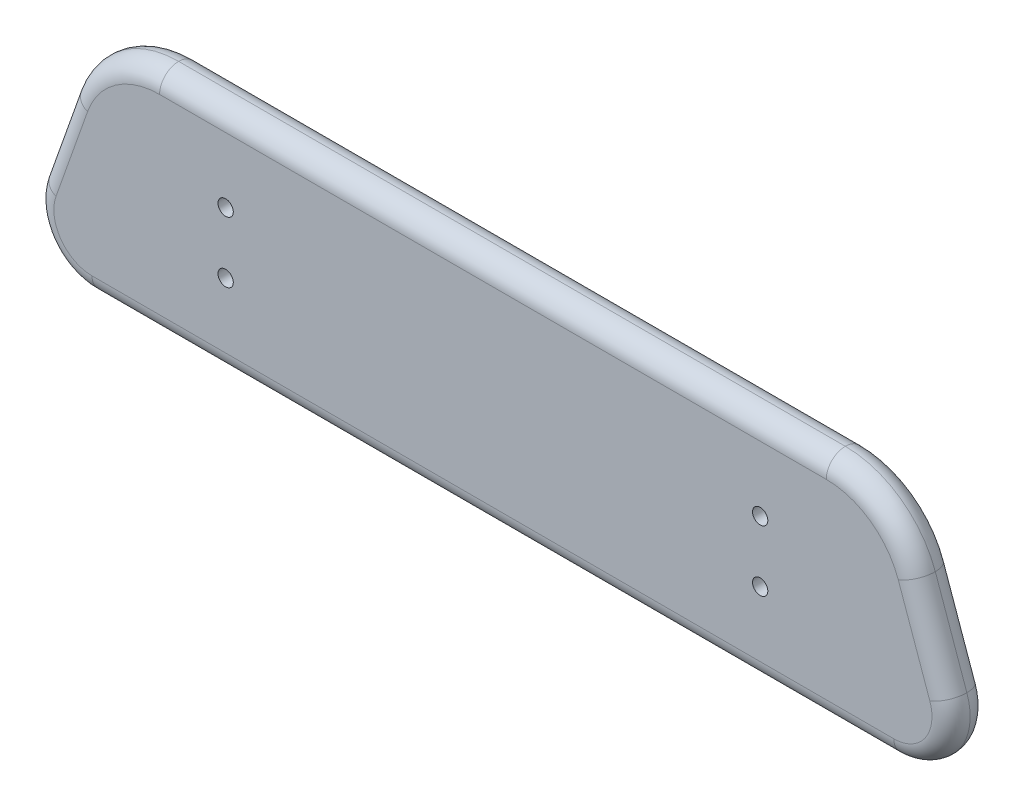
ISO-10303-21;
HEADER;
FILE_DESCRIPTION(('STEP AP214'),'2;1');
FILE_NAME('part.step','',(''),(''),'','','');
FILE_SCHEMA(('AUTOMOTIVE_DESIGN { 1 0 10303 214 1 1 1 1 }'));
ENDSEC;
DATA;
#1=APPLICATION_CONTEXT('core data for automotive mechanical design processes');
#2=APPLICATION_PROTOCOL_DEFINITION('international standard','automotive_design',2000,#1);
#3=PRODUCT_CONTEXT('',#1,'mechanical');
#4=PRODUCT('Part','Part','',(#3));
#5=PRODUCT_RELATED_PRODUCT_CATEGORY('part','',(#4));
#6=PRODUCT_DEFINITION_FORMATION('','',#4);
#7=PRODUCT_DEFINITION_CONTEXT('part definition',#1,'design');
#8=PRODUCT_DEFINITION('design','',#6,#7);
#9=PRODUCT_DEFINITION_SHAPE('','',#8);
#10=(LENGTH_UNIT() NAMED_UNIT(*) SI_UNIT(.MILLI.,.METRE.));
#11=(NAMED_UNIT(*) PLANE_ANGLE_UNIT() SI_UNIT($,.RADIAN.));
#12=(NAMED_UNIT(*) SI_UNIT($,.STERADIAN.) SOLID_ANGLE_UNIT());
#13=UNCERTAINTY_MEASURE_WITH_UNIT(LENGTH_MEASURE(1.E-05),#10,'distance_accuracy_value','');
#14=(GEOMETRIC_REPRESENTATION_CONTEXT(3) GLOBAL_UNCERTAINTY_ASSIGNED_CONTEXT((#13)) GLOBAL_UNIT_ASSIGNED_CONTEXT((#10,
#11,#12)) REPRESENTATION_CONTEXT('',''));
#15=CARTESIAN_POINT('',(0.,0.,0.));
#16=DIRECTION('',(0.,0.,1.));
#17=DIRECTION('',(1.,0.,0.));
#18=AXIS2_PLACEMENT_3D('',#15,#16,#17);
#19=CARTESIAN_POINT('',(-105.000000000001,15.,9.99999999999989));
#20=DIRECTION('',(0.,0.,-1.));
#21=DIRECTION('',(-1.00000000000001,0.,0.));
#22=AXIS2_PLACEMENT_3D('',#19,#20,#21);
#23=PLANE('',#22);
#24=DIRECTION('',(-0.333806859233776,-0.942641491092183,0.));
#25=VECTOR('',#24,1.);
#26=CARTESIAN_POINT('',(-114.426414910922,18.3380685923378,9.99999999999989));
#27=LINE('',#26,#25);
#28=CARTESIAN_POINT('',(-106.16197137538,41.6761371846756,9.99999999999989));
#29=VERTEX_POINT('',#28);
#30=CARTESIAN_POINT('',(-114.426414910922,18.3380685923378,9.99999999999989));
#31=VERTEX_POINT('',#30);
#32=EDGE_CURVE('E52',#29,#31,#27,.T.);
#33=ORIENTED_EDGE('',*,*,#32,.T.);
#34=CARTESIAN_POINT('',(-105.000000000001,15.,9.99999999999989));
#35=DIRECTION('',(0.,0.,-1.));
#36=DIRECTION('',(-1.00000000000001,0.,0.));
#37=AXIS2_PLACEMENT_3D('',#34,#35,#36);
#38=CIRCLE('',#37,9.99999999999999);
#39=CARTESIAN_POINT('',(-105.000000000001,5.,10.));
#40=VERTEX_POINT('',#39);
#41=EDGE_CURVE('E11',#31,#40,#38,.F.);
#42=ORIENTED_EDGE('',*,*,#41,.T.);
#43=DIRECTION('',(1.00000000000001,0.,0.));
#44=VECTOR('',#43,1.);
#45=CARTESIAN_POINT('',(-105.000000000001,5.,10.));
#46=LINE('',#45,#44);
#47=CARTESIAN_POINT('',(105.000000000001,4.99999999999987,10.));
#48=VERTEX_POINT('',#47);
#49=EDGE_CURVE('E309',#40,#48,#46,.T.);
#50=ORIENTED_EDGE('',*,*,#49,.T.);
#51=CARTESIAN_POINT('',(105.000000000001,15.,10.));
#52=DIRECTION('',(0.,0.,-1.));
#53=DIRECTION('',(-1.00000000000001,0.,0.));
#54=AXIS2_PLACEMENT_3D('',#51,#52,#53);
#55=CIRCLE('',#54,10.);
#56=CARTESIAN_POINT('',(114.426414910922,18.3380685923378,10.));
#57=VERTEX_POINT('',#56);
#58=EDGE_CURVE('E312',#48,#57,#55,.F.);
#59=ORIENTED_EDGE('',*,*,#58,.T.);
#60=DIRECTION('',(-0.333806859233776,0.942641491092182,0.));
#61=VECTOR('',#60,1.);
#62=CARTESIAN_POINT('',(91.0267408639035,84.4167096525717,10.));
#63=LINE('',#62,#61);
#64=CARTESIAN_POINT('',(106.16197137538,41.6761371846756,10.));
#65=VERTEX_POINT('',#64);
#66=EDGE_CURVE('E315',#57,#65,#63,.T.);
#67=ORIENTED_EDGE('',*,*,#66,.T.);
#68=CARTESIAN_POINT('',(87.3091415535364,35.0000000000001,10.));
#69=DIRECTION('',(0.,0.,-1.));
#70=DIRECTION('',(-1.00000000000001,0.,0.));
#71=AXIS2_PLACEMENT_3D('',#68,#69,#70);
#72=CIRCLE('',#71,20.);
#73=CARTESIAN_POINT('',(87.3091415535363,55.0000000000002,10.));
#74=VERTEX_POINT('',#73);
#75=EDGE_CURVE('E144',#65,#74,#72,.F.);
#76=ORIENTED_EDGE('',*,*,#75,.T.);
#77=DIRECTION('',(-1.00000000000001,0.,0.));
#78=VECTOR('',#77,1.);
#79=CARTESIAN_POINT('',(-105.000000000001,55.0000000000002,9.99999999999995));
#80=LINE('',#79,#78);
#81=CARTESIAN_POINT('',(-87.3091415535363,55.0000000000002,9.99999999999995));
#82=VERTEX_POINT('',#81);
#83=EDGE_CURVE('E138',#74,#82,#80,.T.);
#84=ORIENTED_EDGE('',*,*,#83,.T.);
#85=CARTESIAN_POINT('',(-87.3091415535362,35.0000000000001,9.99999999999989));
#86=DIRECTION('',(0.,0.,-1.));
#87=DIRECTION('',(-1.00000000000001,0.,0.));
#88=AXIS2_PLACEMENT_3D('',#85,#86,#87);
#89=CIRCLE('',#88,20.);
#90=EDGE_CURVE('E142',#82,#29,#89,.F.);
#91=ORIENTED_EDGE('',*,*,#90,.T.);
#92=EDGE_LOOP('',(#33,#42,#50,#59,#67,#76,#84,#91));
#93=FACE_BOUND('',#92,.T.);
#94=CARTESIAN_POINT('',(-70.0000000000002,38.0000000000001,9.99999999999989));
#95=DIRECTION('',(0.,0.,1.));
#96=DIRECTION('',(1.00000000000001,0.,0.));
#97=AXIS2_PLACEMENT_3D('',#94,#95,#96);
#98=CIRCLE('',#97,2.);
#99=CARTESIAN_POINT('',(-68.0000000000002,38.0000000000001,9.99999999999989));
#100=VERTEX_POINT('',#99);
#101=EDGE_CURVE('E267',#100,#100,#98,.T.);
#102=ORIENTED_EDGE('',*,*,#101,.F.);
#103=EDGE_LOOP('',(#102));
#104=FACE_BOUND('',#103,.T.);
#105=CARTESIAN_POINT('',(70.0000000000003,22.,10.));
#106=DIRECTION('',(0.,0.,1.));
#107=DIRECTION('',(-1.00000000000001,0.,0.));
#108=AXIS2_PLACEMENT_3D('',#105,#106,#107);
#109=CIRCLE('',#108,2.);
#110=CARTESIAN_POINT('',(68.0000000000003,22.,10.));
#111=VERTEX_POINT('',#110);
#112=EDGE_CURVE('E259',#111,#111,#109,.T.);
#113=ORIENTED_EDGE('',*,*,#112,.F.);
#114=EDGE_LOOP('',(#113));
#115=FACE_BOUND('',#114,.T.);
#116=CARTESIAN_POINT('',(70.0000000000005,38.0000000000001,10.));
#117=DIRECTION('',(0.,0.,1.));
#118=DIRECTION('',(-1.00000000000001,0.,0.));
#119=AXIS2_PLACEMENT_3D('',#116,#117,#118);
#120=CIRCLE('',#119,2.);
#121=CARTESIAN_POINT('',(68.0000000000005,38.0000000000001,10.));
#122=VERTEX_POINT('',#121);
#123=EDGE_CURVE('E248',#122,#122,#120,.T.);
#124=ORIENTED_EDGE('',*,*,#123,.F.);
#125=EDGE_LOOP('',(#124));
#126=FACE_BOUND('',#125,.T.);
#127=CARTESIAN_POINT('',(-70.0000000000003,22.,9.99999999999989));
#128=DIRECTION('',(0.,0.,1.));
#129=DIRECTION('',(1.00000000000001,0.,0.));
#130=AXIS2_PLACEMENT_3D('',#127,#128,#129);
#131=CIRCLE('',#130,2.);
#132=CARTESIAN_POINT('',(-68.0000000000003,22.,9.99999999999989));
#133=VERTEX_POINT('',#132);
#134=EDGE_CURVE('E266',#133,#133,#131,.T.);
#135=ORIENTED_EDGE('',*,*,#134,.F.);
#136=EDGE_LOOP('',(#135));
#137=FACE_BOUND('',#136,.T.);
#138=ADVANCED_FACE('F41',(#93,#104,#115,#126,#137),#23,.F.);
#139=CARTESIAN_POINT('',(-105.000000000001,14.9999999999999,-1.17961196366423E-13));
#140=DIRECTION('',(0.,0.,-1.));
#141=DIRECTION('',(-1.00000000000001,0.,0.));
#142=AXIS2_PLACEMENT_3D('',#139,#140,#141);
#143=PLANE('',#142);
#144=DIRECTION('',(1.00000000000001,0.,0.));
#145=VECTOR('',#144,1.);
#146=CARTESIAN_POINT('',(-105.000000000001,4.99999999999999,-1.17961196366423E-13));
#147=LINE('',#146,#145);
#148=CARTESIAN_POINT('',(105.000000000001,5.,0.));
#149=VERTEX_POINT('',#148);
#150=CARTESIAN_POINT('',(-105.000000000001,4.99999999999999,-1.17961196366423E-13));
#151=VERTEX_POINT('',#150);
#152=EDGE_CURVE('E282',#149,#151,#147,.F.);
#153=ORIENTED_EDGE('',*,*,#152,.T.);
#154=CARTESIAN_POINT('',(-105.000000000001,14.9999999999999,-1.17961196366423E-13));
#155=DIRECTION('',(0.,0.,-1.));
#156=DIRECTION('',(-1.00000000000001,0.,0.));
#157=AXIS2_PLACEMENT_3D('',#154,#155,#156);
#158=CIRCLE('',#157,9.99999999999999);
#159=CARTESIAN_POINT('',(-114.426414910922,18.3380685923378,-1.17961196366423E-13));
#160=VERTEX_POINT('',#159);
#161=EDGE_CURVE('E305',#151,#160,#158,.T.);
#162=ORIENTED_EDGE('',*,*,#161,.T.);
#163=DIRECTION('',(-0.333806859233776,-0.942641491092183,0.));
#164=VECTOR('',#163,1.);
#165=CARTESIAN_POINT('',(-106.16197137538,41.6761371846757,-1.17961196366423E-13));
#166=LINE('',#165,#164);
#167=CARTESIAN_POINT('',(-106.16197137538,41.6761371846757,-1.17961196366423E-13));
#168=VERTEX_POINT('',#167);
#169=EDGE_CURVE('E302',#160,#168,#166,.F.);
#170=ORIENTED_EDGE('',*,*,#169,.T.);
#171=CARTESIAN_POINT('',(-87.3091415535362,35.0000000000001,-1.17961196366423E-13));
#172=DIRECTION('',(0.,0.,-1.));
#173=DIRECTION('',(-1.00000000000001,0.,0.));
#174=AXIS2_PLACEMENT_3D('',#171,#172,#173);
#175=CIRCLE('',#174,20.);
#176=CARTESIAN_POINT('',(-87.3091415535363,55.0000000000002,0.));
#177=VERTEX_POINT('',#176);
#178=EDGE_CURVE('E299',#168,#177,#175,.T.);
#179=ORIENTED_EDGE('',*,*,#178,.T.);
#180=DIRECTION('',(-1.00000000000001,0.,0.));
#181=VECTOR('',#180,1.);
#182=CARTESIAN_POINT('',(87.3091415535363,55.0000000000002,0.));
#183=LINE('',#182,#181);
#184=CARTESIAN_POINT('',(87.3091415535363,55.0000000000002,0.));
#185=VERTEX_POINT('',#184);
#186=EDGE_CURVE('E296',#177,#185,#183,.F.);
#187=ORIENTED_EDGE('',*,*,#186,.T.);
#188=CARTESIAN_POINT('',(87.3091415535364,35.0000000000001,0.));
#189=DIRECTION('',(0.,0.,-1.));
#190=DIRECTION('',(-1.00000000000001,0.,0.));
#191=AXIS2_PLACEMENT_3D('',#188,#189,#190);
#192=CIRCLE('',#191,20.);
#193=CARTESIAN_POINT('',(106.16197137538,41.6761371846756,0.));
#194=VERTEX_POINT('',#193);
#195=EDGE_CURVE('E293',#185,#194,#192,.T.);
#196=ORIENTED_EDGE('',*,*,#195,.T.);
#197=DIRECTION('',(-0.333806859233776,0.942641491092182,0.));
#198=VECTOR('',#197,1.);
#199=CARTESIAN_POINT('',(114.426414910922,18.3380685923378,0.));
#200=LINE('',#199,#198);
#201=CARTESIAN_POINT('',(114.426414910922,18.3380685923378,0.));
#202=VERTEX_POINT('',#201);
#203=EDGE_CURVE('E290',#194,#202,#200,.F.);
#204=ORIENTED_EDGE('',*,*,#203,.T.);
#205=CARTESIAN_POINT('',(105.000000000001,15.,0.));
#206=DIRECTION('',(0.,0.,-1.));
#207=DIRECTION('',(-1.00000000000001,0.,0.));
#208=AXIS2_PLACEMENT_3D('',#205,#206,#207);
#209=CIRCLE('',#208,10.);
#210=EDGE_CURVE('E102',#202,#149,#209,.T.);
#211=ORIENTED_EDGE('',*,*,#210,.T.);
#212=EDGE_LOOP('',(#153,#162,#170,#179,#187,#196,#204,#211));
#213=FACE_BOUND('',#212,.T.);
#214=ADVANCED_FACE('F384',(#213),#143,.T.);
#215=CARTESIAN_POINT('',(-70.0000000000003,22.,1.99999999999988));
#216=DIRECTION('',(0.,0.,1.));
#217=DIRECTION('',(1.00000000000001,0.,0.));
#218=AXIS2_PLACEMENT_3D('',#215,#216,#217);
#219=CYLINDRICAL_SURFACE('',#218,2.);
#220=CARTESIAN_POINT('',(-70.0000000000003,22.,1.99999999999988));
#221=DIRECTION('',(0.,0.,1.));
#222=DIRECTION('',(1.00000000000001,0.,0.));
#223=AXIS2_PLACEMENT_3D('',#220,#221,#222);
#224=CIRCLE('',#223,2.);
#225=CARTESIAN_POINT('',(-68.0000000000003,22.,1.99999999999988));
#226=VERTEX_POINT('',#225);
#227=EDGE_CURVE('E278',#226,#226,#224,.T.);
#228=ORIENTED_EDGE('',*,*,#227,.F.);
#229=EDGE_LOOP('',(#228));
#230=FACE_BOUND('',#229,.T.);
#231=ORIENTED_EDGE('',*,*,#134,.T.);
#232=EDGE_LOOP('',(#231));
#233=FACE_BOUND('',#232,.T.);
#234=ADVANCED_FACE('F389',(#230,#233),#219,.F.);
#235=CARTESIAN_POINT('',(-70.0000000000003,22.,1.99999999999988));
#236=DIRECTION('',(0.,0.,1.));
#237=DIRECTION('',(1.00000000000001,0.,0.));
#238=AXIS2_PLACEMENT_3D('',#235,#236,#237);
#239=PLANE('',#238);
#240=ORIENTED_EDGE('',*,*,#227,.T.);
#241=EDGE_LOOP('',(#240));
#242=FACE_BOUND('',#241,.T.);
#243=ADVANCED_FACE('F566',(#242),#239,.T.);
#244=CARTESIAN_POINT('',(70.0000000000005,38.0000000000001,2.));
#245=DIRECTION('',(0.,0.,1.));
#246=DIRECTION('',(1.00000000000001,0.,0.));
#247=AXIS2_PLACEMENT_3D('',#244,#245,#246);
#248=CYLINDRICAL_SURFACE('',#247,2.);
#249=CARTESIAN_POINT('',(70.0000000000005,38.0000000000001,2.));
#250=DIRECTION('',(0.,0.,1.));
#251=DIRECTION('',(-1.00000000000001,0.,0.));
#252=AXIS2_PLACEMENT_3D('',#249,#250,#251);
#253=CIRCLE('',#252,2.);
#254=CARTESIAN_POINT('',(68.0000000000005,38.0000000000001,2.));
#255=VERTEX_POINT('',#254);
#256=EDGE_CURVE('E252',#255,#255,#253,.T.);
#257=ORIENTED_EDGE('',*,*,#256,.F.);
#258=EDGE_LOOP('',(#257));
#259=FACE_BOUND('',#258,.T.);
#260=ORIENTED_EDGE('',*,*,#123,.T.);
#261=EDGE_LOOP('',(#260));
#262=FACE_BOUND('',#261,.T.);
#263=ADVANCED_FACE('F557',(#259,#262),#248,.F.);
#264=CARTESIAN_POINT('',(70.0000000000005,38.0000000000001,2.));
#265=DIRECTION('',(0.,0.,-1.));
#266=DIRECTION('',(-1.00000000000001,0.,0.));
#267=AXIS2_PLACEMENT_3D('',#264,#265,#266);
#268=PLANE('',#267);
#269=ORIENTED_EDGE('',*,*,#256,.T.);
#270=EDGE_LOOP('',(#269));
#271=FACE_BOUND('',#270,.T.);
#272=ADVANCED_FACE('F548',(#271),#268,.F.);
#273=CARTESIAN_POINT('',(70.0000000000003,22.,2.));
#274=DIRECTION('',(0.,0.,1.));
#275=DIRECTION('',(1.00000000000001,0.,0.));
#276=AXIS2_PLACEMENT_3D('',#273,#274,#275);
#277=CYLINDRICAL_SURFACE('',#276,2.);
#278=CARTESIAN_POINT('',(70.0000000000003,22.,2.));
#279=DIRECTION('',(0.,0.,1.));
#280=DIRECTION('',(-1.00000000000001,0.,0.));
#281=AXIS2_PLACEMENT_3D('',#278,#279,#280);
#282=CIRCLE('',#281,2.);
#283=CARTESIAN_POINT('',(68.0000000000003,22.,2.));
#284=VERTEX_POINT('',#283);
#285=EDGE_CURVE('E271',#284,#284,#282,.T.);
#286=ORIENTED_EDGE('',*,*,#285,.F.);
#287=EDGE_LOOP('',(#286));
#288=FACE_BOUND('',#287,.T.);
#289=ORIENTED_EDGE('',*,*,#112,.T.);
#290=EDGE_LOOP('',(#289));
#291=FACE_BOUND('',#290,.T.);
#292=ADVANCED_FACE('F539',(#288,#291),#277,.F.);
#293=CARTESIAN_POINT('',(70.0000000000003,22.,2.));
#294=DIRECTION('',(0.,0.,-1.));
#295=DIRECTION('',(-1.00000000000001,0.,0.));
#296=AXIS2_PLACEMENT_3D('',#293,#294,#295);
#297=PLANE('',#296);
#298=ORIENTED_EDGE('',*,*,#285,.T.);
#299=EDGE_LOOP('',(#298));
#300=FACE_BOUND('',#299,.T.);
#301=ADVANCED_FACE('F530',(#300),#297,.F.);
#302=CARTESIAN_POINT('',(-70.0000000000002,38.0000000000001,1.99999999999988));
#303=DIRECTION('',(0.,0.,1.));
#304=DIRECTION('',(1.00000000000001,0.,0.));
#305=AXIS2_PLACEMENT_3D('',#302,#303,#304);
#306=CYLINDRICAL_SURFACE('',#305,2.);
#307=CARTESIAN_POINT('',(-70.0000000000002,38.0000000000001,1.99999999999988));
#308=DIRECTION('',(0.,0.,1.));
#309=DIRECTION('',(1.00000000000001,0.,0.));
#310=AXIS2_PLACEMENT_3D('',#307,#308,#309);
#311=CIRCLE('',#310,2.);
#312=CARTESIAN_POINT('',(-68.0000000000002,38.0000000000001,1.99999999999988));
#313=VERTEX_POINT('',#312);
#314=EDGE_CURVE('E262',#313,#313,#311,.T.);
#315=ORIENTED_EDGE('',*,*,#314,.F.);
#316=EDGE_LOOP('',(#315));
#317=FACE_BOUND('',#316,.T.);
#318=ORIENTED_EDGE('',*,*,#101,.T.);
#319=EDGE_LOOP('',(#318));
#320=FACE_BOUND('',#319,.T.);
#321=ADVANCED_FACE('F521',(#317,#320),#306,.F.);
#322=CARTESIAN_POINT('',(-70.0000000000002,38.0000000000001,1.99999999999988));
#323=DIRECTION('',(0.,0.,1.));
#324=DIRECTION('',(1.00000000000001,0.,0.));
#325=AXIS2_PLACEMENT_3D('',#322,#323,#324);
#326=PLANE('',#325);
#327=ORIENTED_EDGE('',*,*,#314,.T.);
#328=EDGE_LOOP('',(#327));
#329=FACE_BOUND('',#328,.T.);
#330=ADVANCED_FACE('F514',(#329),#326,.T.);
#331=CARTESIAN_POINT('',(87.3091415535364,35.0000000000001,5.));
#332=DIRECTION('',(0.,0.,-1.));
#333=DIRECTION('',(-1.00000000000001,0.,0.));
#334=AXIS2_PLACEMENT_3D('',#331,#332,#333);
#335=TOROIDAL_SURFACE('',#334,20.,5.);
#336=CARTESIAN_POINT('',(87.3091415535363,55.0000000000002,5.));
#337=DIRECTION('',(-1.00000000000001,0.,0.));
#338=DIRECTION('',(0.,0.,1.));
#339=AXIS2_PLACEMENT_3D('',#336,#337,#338);
#340=CIRCLE('',#339,5.);
#341=CARTESIAN_POINT('',(87.3091415535364,60.0000000000003,5.));
#342=VERTEX_POINT('',#341);
#343=EDGE_CURVE('E45',#74,#342,#340,.T.);
#344=ORIENTED_EDGE('',*,*,#343,.F.);
#345=ORIENTED_EDGE('',*,*,#75,.F.);
#346=CARTESIAN_POINT('',(106.16197137538,41.6761371846756,5.));
#347=DIRECTION('',(0.333806859233776,-0.942641491092182,0.));
#348=DIRECTION('',(0.942641491092182,0.333806859233776,0.));
#349=AXIS2_PLACEMENT_3D('',#346,#347,#348);
#350=CIRCLE('',#349,5.);
#351=CARTESIAN_POINT('',(110.875178830841,43.3451714808446,5.));
#352=VERTEX_POINT('',#351);
#353=EDGE_CURVE('E88',#352,#65,#350,.T.);
#354=ORIENTED_EDGE('',*,*,#353,.F.);
#355=CARTESIAN_POINT('',(87.3091415535364,35.0000000000001,5.));
#356=DIRECTION('',(0.,0.,-1.));
#357=DIRECTION('',(-1.00000000000001,0.,0.));
#358=AXIS2_PLACEMENT_3D('',#355,#356,#357);
#359=CIRCLE('',#358,25.);
#360=EDGE_CURVE('E240',#342,#352,#359,.T.);
#361=ORIENTED_EDGE('',*,*,#360,.F.);
#362=EDGE_LOOP('',(#344,#345,#354,#361));
#363=FACE_BOUND('',#362,.T.);
#364=ADVANCED_FACE('F43',(#363),#335,.T.);
#365=CARTESIAN_POINT('',(-105.000000000001,55.0000000000002,5.));
#366=DIRECTION('',(-1.00000000000001,0.,0.));
#367=DIRECTION('',(0.,-1.00000000000001,0.));
#368=AXIS2_PLACEMENT_3D('',#365,#366,#367);
#369=CYLINDRICAL_SURFACE('',#368,5.);
#370=ORIENTED_EDGE('',*,*,#83,.F.);
#371=ORIENTED_EDGE('',*,*,#343,.T.);
#372=DIRECTION('',(-1.00000000000001,0.,0.));
#373=VECTOR('',#372,1.);
#374=CARTESIAN_POINT('',(-87.3091415535362,60.0000000000003,5.));
#375=LINE('',#374,#373);
#376=CARTESIAN_POINT('',(-87.3091415535362,60.0000000000003,5.));
#377=VERTEX_POINT('',#376);
#378=EDGE_CURVE('E151',#377,#342,#375,.F.);
#379=ORIENTED_EDGE('',*,*,#378,.F.);
#380=CARTESIAN_POINT('',(-87.3091415535363,55.0000000000002,5.));
#381=DIRECTION('',(-1.00000000000001,0.,0.));
#382=DIRECTION('',(0.,0.,1.));
#383=AXIS2_PLACEMENT_3D('',#380,#381,#382);
#384=CIRCLE('',#383,5.);
#385=EDGE_CURVE('E148',#82,#377,#384,.T.);
#386=ORIENTED_EDGE('',*,*,#385,.F.);
#387=EDGE_LOOP('',(#370,#371,#379,#386));
#388=FACE_BOUND('',#387,.T.);
#389=ADVANCED_FACE('F149',(#388),#369,.T.);
#390=CARTESIAN_POINT('',(91.0267408639035,84.4167096525717,5.));
#391=DIRECTION('',(-0.333806859233776,0.942641491092182,0.));
#392=DIRECTION('',(-0.942641491092182,-0.333806859233776,0.));
#393=AXIS2_PLACEMENT_3D('',#390,#391,#392);
#394=CYLINDRICAL_SURFACE('',#393,5.);
#395=ORIENTED_EDGE('',*,*,#353,.T.);
#396=ORIENTED_EDGE('',*,*,#66,.F.);
#397=CARTESIAN_POINT('',(114.426414910922,18.3380685923378,5.));
#398=DIRECTION('',(0.333806859233776,-0.942641491092182,0.));
#399=DIRECTION('',(0.942641491092182,0.333806859233776,0.));
#400=AXIS2_PLACEMENT_3D('',#397,#398,#399);
#401=CIRCLE('',#400,5.);
#402=CARTESIAN_POINT('',(119.139622366383,20.0071028885066,5.));
#403=VERTEX_POINT('',#402);
#404=EDGE_CURVE('E155',#403,#57,#401,.T.);
#405=ORIENTED_EDGE('',*,*,#404,.F.);
#406=DIRECTION('',(-0.333806859233776,0.942641491092182,0.));
#407=VECTOR('',#406,1.);
#408=CARTESIAN_POINT('',(110.875178830841,43.3451714808446,5.));
#409=LINE('',#408,#407);
#410=EDGE_CURVE('E227',#352,#403,#409,.F.);
#411=ORIENTED_EDGE('',*,*,#410,.F.);
#412=EDGE_LOOP('',(#395,#396,#405,#411));
#413=FACE_BOUND('',#412,.T.);
#414=ADVANCED_FACE('F375',(#413),#394,.T.);
#415=CARTESIAN_POINT('',(87.3091415535364,35.0000000000001,5.));
#416=DIRECTION('',(0.,0.,-1.));
#417=DIRECTION('',(-1.00000000000001,0.,0.));
#418=AXIS2_PLACEMENT_3D('',#415,#416,#417);
#419=TOROIDAL_SURFACE('',#418,20.,5.);
#420=CARTESIAN_POINT('',(106.16197137538,41.6761371846756,5.));
#421=DIRECTION('',(0.333806859233776,-0.942641491092182,0.));
#422=DIRECTION('',(0.942641491092182,0.333806859233776,0.));
#423=AXIS2_PLACEMENT_3D('',#420,#421,#422);
#424=CIRCLE('',#423,5.);
#425=EDGE_CURVE('E223',#194,#352,#424,.T.);
#426=ORIENTED_EDGE('',*,*,#425,.F.);
#427=ORIENTED_EDGE('',*,*,#195,.F.);
#428=CARTESIAN_POINT('',(87.3091415535363,55.0000000000002,5.));
#429=DIRECTION('',(-1.00000000000001,0.,0.));
#430=DIRECTION('',(0.,0.,1.));
#431=AXIS2_PLACEMENT_3D('',#428,#429,#430);
#432=CIRCLE('',#431,5.);
#433=EDGE_CURVE('E236',#342,#185,#432,.T.);
#434=ORIENTED_EDGE('',*,*,#433,.F.);
#435=ORIENTED_EDGE('',*,*,#360,.T.);
#436=EDGE_LOOP('',(#426,#427,#434,#435));
#437=FACE_BOUND('',#436,.T.);
#438=ADVANCED_FACE('F343',(#437),#419,.T.);
#439=CARTESIAN_POINT('',(-87.3091415535363,55.0000000000002,5.));
#440=DIRECTION('',(1.00000000000001,0.,0.));
#441=DIRECTION('',(0.,1.00000000000001,0.));
#442=AXIS2_PLACEMENT_3D('',#439,#440,#441);
#443=CYLINDRICAL_SURFACE('',#442,5.);
#444=ORIENTED_EDGE('',*,*,#433,.T.);
#445=ORIENTED_EDGE('',*,*,#186,.F.);
#446=CARTESIAN_POINT('',(-87.3091415535363,55.0000000000002,5.));
#447=DIRECTION('',(-1.00000000000001,0.,0.));
#448=DIRECTION('',(0.,0.,1.));
#449=AXIS2_PLACEMENT_3D('',#446,#447,#448);
#450=CIRCLE('',#449,5.);
#451=EDGE_CURVE('E219',#377,#177,#450,.T.);
#452=ORIENTED_EDGE('',*,*,#451,.F.);
#453=ORIENTED_EDGE('',*,*,#378,.T.);
#454=EDGE_LOOP('',(#444,#445,#452,#453));
#455=FACE_BOUND('',#454,.T.);
#456=ADVANCED_FACE('F346',(#455),#443,.T.);
#457=CARTESIAN_POINT('',(-87.3091415535362,35.0000000000001,4.99999999999989));
#458=DIRECTION('',(0.,0.,-1.));
#459=DIRECTION('',(-1.00000000000001,0.,0.));
#460=AXIS2_PLACEMENT_3D('',#457,#458,#459);
#461=TOROIDAL_SURFACE('',#460,20.,5.);
#462=ORIENTED_EDGE('',*,*,#90,.F.);
#463=ORIENTED_EDGE('',*,*,#385,.T.);
#464=CARTESIAN_POINT('',(-87.3091415535362,35.0000000000001,4.99999999999989));
#465=DIRECTION('',(0.,0.,-1.));
#466=DIRECTION('',(-1.00000000000001,0.,0.));
#467=AXIS2_PLACEMENT_3D('',#464,#465,#466);
#468=CIRCLE('',#467,25.);
#469=CARTESIAN_POINT('',(-110.875178830841,43.3451714808444,4.99999999999989));
#470=VERTEX_POINT('',#469);
#471=EDGE_CURVE('E215',#470,#377,#468,.T.);
#472=ORIENTED_EDGE('',*,*,#471,.F.);
#473=CARTESIAN_POINT('',(-106.16197137538,41.6761371846756,4.99999999999989));
#474=DIRECTION('',(-0.333806859233776,-0.942641491092182,0.));
#475=DIRECTION('',(0.942641491092182,-0.333806859233776,0.));
#476=AXIS2_PLACEMENT_3D('',#473,#474,#475);
#477=CIRCLE('',#476,5.);
#478=EDGE_CURVE('E159',#29,#470,#477,.T.);
#479=ORIENTED_EDGE('',*,*,#478,.F.);
#480=EDGE_LOOP('',(#462,#463,#472,#479));
#481=FACE_BOUND('',#480,.T.);
#482=ADVANCED_FACE('F157',(#481),#461,.T.);
#483=CARTESIAN_POINT('',(105.000000000001,15.,5.));
#484=DIRECTION('',(0.,0.,-1.));
#485=DIRECTION('',(-1.00000000000001,0.,0.));
#486=AXIS2_PLACEMENT_3D('',#483,#484,#485);
#487=TOROIDAL_SURFACE('',#486,10.,5.);
#488=ORIENTED_EDGE('',*,*,#404,.T.);
#489=ORIENTED_EDGE('',*,*,#58,.F.);
#490=CARTESIAN_POINT('',(105.000000000001,4.99999999999985,5.));
#491=DIRECTION('',(-1.00000000000001,0.,0.));
#492=DIRECTION('',(0.,0.,1.));
#493=AXIS2_PLACEMENT_3D('',#490,#491,#492);
#494=CIRCLE('',#493,5.);
#495=CARTESIAN_POINT('',(105.000000000001,-1.2490009027033E-13,5.));
#496=VERTEX_POINT('',#495);
#497=EDGE_CURVE('E209',#496,#48,#494,.T.);
#498=ORIENTED_EDGE('',*,*,#497,.F.);
#499=CARTESIAN_POINT('',(105.000000000001,15.,5.));
#500=DIRECTION('',(0.,0.,-1.));
#501=DIRECTION('',(-1.00000000000001,0.,0.));
#502=AXIS2_PLACEMENT_3D('',#499,#500,#501);
#503=CIRCLE('',#502,15.);
#504=EDGE_CURVE('E205',#403,#496,#503,.T.);
#505=ORIENTED_EDGE('',*,*,#504,.F.);
#506=EDGE_LOOP('',(#488,#489,#498,#505));
#507=FACE_BOUND('',#506,.T.);
#508=ADVANCED_FACE('F361',(#507),#487,.T.);
#509=CARTESIAN_POINT('',(106.16197137538,41.6761371846756,5.));
#510=DIRECTION('',(0.333806859233776,-0.942641491092182,0.));
#511=DIRECTION('',(0.942641491092182,0.333806859233776,0.));
#512=AXIS2_PLACEMENT_3D('',#509,#510,#511);
#513=CYLINDRICAL_SURFACE('',#512,5.);
#514=ORIENTED_EDGE('',*,*,#425,.T.);
#515=ORIENTED_EDGE('',*,*,#410,.T.);
#516=CARTESIAN_POINT('',(114.426414910922,18.3380685923378,5.));
#517=DIRECTION('',(0.333806859233776,-0.942641491092182,0.));
#518=DIRECTION('',(0.942641491092182,0.333806859233776,0.));
#519=AXIS2_PLACEMENT_3D('',#516,#517,#518);
#520=CIRCLE('',#519,5.);
#521=EDGE_CURVE('E201',#202,#403,#520,.T.);
#522=ORIENTED_EDGE('',*,*,#521,.F.);
#523=ORIENTED_EDGE('',*,*,#203,.F.);
#524=EDGE_LOOP('',(#514,#515,#522,#523));
#525=FACE_BOUND('',#524,.T.);
#526=ADVANCED_FACE('F374',(#525),#513,.T.);
#527=CARTESIAN_POINT('',(-87.3091415535362,35.0000000000001,4.99999999999989));
#528=DIRECTION('',(0.,0.,-1.));
#529=DIRECTION('',(-1.00000000000001,0.,0.));
#530=AXIS2_PLACEMENT_3D('',#527,#528,#529);
#531=TOROIDAL_SURFACE('',#530,20.,5.);
#532=ORIENTED_EDGE('',*,*,#451,.T.);
#533=ORIENTED_EDGE('',*,*,#178,.F.);
#534=CARTESIAN_POINT('',(-106.16197137538,41.6761371846756,4.99999999999989));
#535=DIRECTION('',(-0.333806859233776,-0.942641491092182,0.));
#536=DIRECTION('',(0.942641491092182,-0.333806859233776,0.));
#537=AXIS2_PLACEMENT_3D('',#534,#535,#536);
#538=CIRCLE('',#537,5.);
#539=EDGE_CURVE('E197',#470,#168,#538,.T.);
#540=ORIENTED_EDGE('',*,*,#539,.F.);
#541=ORIENTED_EDGE('',*,*,#471,.T.);
#542=EDGE_LOOP('',(#532,#533,#540,#541));
#543=FACE_BOUND('',#542,.T.);
#544=ADVANCED_FACE('F350',(#543),#531,.T.);
#545=CARTESIAN_POINT('',(-114.426414910922,18.3380685923378,4.99999999999989));
#546=DIRECTION('',(-0.333806859233776,-0.942641491092183,0.));
#547=DIRECTION('',(0.942641491092183,-0.333806859233776,0.));
#548=AXIS2_PLACEMENT_3D('',#545,#546,#547);
#549=CYLINDRICAL_SURFACE('',#548,5.);
#550=ORIENTED_EDGE('',*,*,#32,.F.);
#551=ORIENTED_EDGE('',*,*,#478,.T.);
#552=DIRECTION('',(-0.333806859233776,-0.942641491092183,0.));
#553=VECTOR('',#552,1.);
#554=CARTESIAN_POINT('',(-119.139622366383,20.0071028885066,4.99999999999989));
#555=LINE('',#554,#553);
#556=CARTESIAN_POINT('',(-119.139622366383,20.0071028885066,4.99999999999989));
#557=VERTEX_POINT('',#556);
#558=EDGE_CURVE('E193',#557,#470,#555,.F.);
#559=ORIENTED_EDGE('',*,*,#558,.F.);
#560=CARTESIAN_POINT('',(-114.426414910922,18.3380685923378,4.99999999999989));
#561=DIRECTION('',(-0.333806859233776,-0.942641491092182,0.));
#562=DIRECTION('',(0.942641491092182,-0.333806859233776,0.));
#563=AXIS2_PLACEMENT_3D('',#560,#561,#562);
#564=CIRCLE('',#563,5.);
#565=EDGE_CURVE('E189',#31,#557,#564,.T.);
#566=ORIENTED_EDGE('',*,*,#565,.F.);
#567=EDGE_LOOP('',(#550,#551,#559,#566));
#568=FACE_BOUND('',#567,.T.);
#569=ADVANCED_FACE('F352',(#568),#549,.T.);
#570=CARTESIAN_POINT('',(-105.000000000001,4.99999999999996,5.));
#571=DIRECTION('',(1.00000000000001,0.,0.));
#572=DIRECTION('',(0.,1.00000000000001,0.));
#573=AXIS2_PLACEMENT_3D('',#570,#571,#572);
#574=CYLINDRICAL_SURFACE('',#573,5.);
#575=ORIENTED_EDGE('',*,*,#497,.T.);
#576=ORIENTED_EDGE('',*,*,#49,.F.);
#577=CARTESIAN_POINT('',(-105.000000000001,4.99999999999996,5.));
#578=DIRECTION('',(-1.00000000000001,0.,0.));
#579=DIRECTION('',(0.,0.,1.));
#580=AXIS2_PLACEMENT_3D('',#577,#578,#579);
#581=CIRCLE('',#580,5.);
#582=CARTESIAN_POINT('',(-105.000000000001,-1.38777878078145E-13,5.));
#583=VERTEX_POINT('',#582);
#584=EDGE_CURVE('E186',#583,#40,#581,.T.);
#585=ORIENTED_EDGE('',*,*,#584,.F.);
#586=DIRECTION('',(1.00000000000001,0.,0.));
#587=VECTOR('',#586,1.);
#588=CARTESIAN_POINT('',(0.,-1.38777878078145E-13,5.));
#589=LINE('',#588,#587);
#590=EDGE_CURVE('E182',#496,#583,#589,.F.);
#591=ORIENTED_EDGE('',*,*,#590,.F.);
#592=EDGE_LOOP('',(#575,#576,#585,#591));
#593=FACE_BOUND('',#592,.T.);
#594=ADVANCED_FACE('F364',(#593),#574,.T.);
#595=CARTESIAN_POINT('',(105.000000000001,15.,5.));
#596=DIRECTION('',(0.,0.,-1.));
#597=DIRECTION('',(-1.00000000000001,0.,0.));
#598=AXIS2_PLACEMENT_3D('',#595,#596,#597);
#599=TOROIDAL_SURFACE('',#598,10.,5.);
#600=ORIENTED_EDGE('',*,*,#521,.T.);
#601=ORIENTED_EDGE('',*,*,#504,.T.);
#602=CARTESIAN_POINT('',(105.000000000001,4.99999999999985,5.));
#603=DIRECTION('',(-1.00000000000001,0.,0.));
#604=DIRECTION('',(0.,0.,1.));
#605=AXIS2_PLACEMENT_3D('',#602,#603,#604);
#606=CIRCLE('',#605,5.);
#607=EDGE_CURVE('E178',#149,#496,#606,.T.);
#608=ORIENTED_EDGE('',*,*,#607,.F.);
#609=ORIENTED_EDGE('',*,*,#210,.F.);
#610=EDGE_LOOP('',(#600,#601,#608,#609));
#611=FACE_BOUND('',#610,.T.);
#612=ADVANCED_FACE('F370',(#611),#599,.T.);
#613=CARTESIAN_POINT('',(-114.426414910922,18.3380685923378,4.99999999999989));
#614=DIRECTION('',(0.333806859233776,0.942641491092183,0.));
#615=DIRECTION('',(-0.942641491092183,0.333806859233776,0.));
#616=AXIS2_PLACEMENT_3D('',#613,#614,#615);
#617=CYLINDRICAL_SURFACE('',#616,5.);
#618=ORIENTED_EDGE('',*,*,#539,.T.);
#619=ORIENTED_EDGE('',*,*,#169,.F.);
#620=CARTESIAN_POINT('',(-114.426414910922,18.3380685923378,4.99999999999989));
#621=DIRECTION('',(-0.333806859233775,-0.942641491092183,0.));
#622=DIRECTION('',(0.942641491092183,-0.333806859233775,0.));
#623=AXIS2_PLACEMENT_3D('',#620,#621,#622);
#624=CIRCLE('',#623,5.);
#625=EDGE_CURVE('E175',#557,#160,#624,.T.);
#626=ORIENTED_EDGE('',*,*,#625,.F.);
#627=ORIENTED_EDGE('',*,*,#558,.T.);
#628=EDGE_LOOP('',(#618,#619,#626,#627));
#629=FACE_BOUND('',#628,.T.);
#630=ADVANCED_FACE('F402',(#629),#617,.T.);
#631=CARTESIAN_POINT('',(-105.000000000001,14.9999999999999,4.99999999999989));
#632=DIRECTION('',(0.,0.,-1.));
#633=DIRECTION('',(-1.00000000000001,0.,0.));
#634=AXIS2_PLACEMENT_3D('',#631,#632,#633);
#635=TOROIDAL_SURFACE('',#634,9.99999999999999,5.);
#636=ORIENTED_EDGE('',*,*,#41,.F.);
#637=ORIENTED_EDGE('',*,*,#565,.T.);
#638=CARTESIAN_POINT('',(-105.000000000001,14.9999999999999,4.99999999999989));
#639=DIRECTION('',(0.,0.,-1.));
#640=DIRECTION('',(-1.00000000000001,0.,0.));
#641=AXIS2_PLACEMENT_3D('',#638,#639,#640);
#642=CIRCLE('',#641,15.);
#643=EDGE_CURVE('E171',#583,#557,#642,.T.);
#644=ORIENTED_EDGE('',*,*,#643,.F.);
#645=ORIENTED_EDGE('',*,*,#584,.T.);
#646=EDGE_LOOP('',(#636,#637,#644,#645));
#647=FACE_BOUND('',#646,.T.);
#648=ADVANCED_FACE('F357',(#647),#635,.T.);
#649=CARTESIAN_POINT('',(0.,4.99999999999987,5.));
#650=DIRECTION('',(-1.00000000000001,0.,0.));
#651=DIRECTION('',(0.,-1.00000000000001,0.));
#652=AXIS2_PLACEMENT_3D('',#649,#650,#651);
#653=CYLINDRICAL_SURFACE('',#652,5.);
#654=ORIENTED_EDGE('',*,*,#607,.T.);
#655=ORIENTED_EDGE('',*,*,#590,.T.);
#656=CARTESIAN_POINT('',(-105.000000000001,4.99999999999996,5.));
#657=DIRECTION('',(-1.00000000000001,0.,0.));
#658=DIRECTION('',(0.,0.,1.));
#659=AXIS2_PLACEMENT_3D('',#656,#657,#658);
#660=CIRCLE('',#659,5.);
#661=EDGE_CURVE('E167',#151,#583,#660,.T.);
#662=ORIENTED_EDGE('',*,*,#661,.F.);
#663=ORIENTED_EDGE('',*,*,#152,.F.);
#664=EDGE_LOOP('',(#654,#655,#662,#663));
#665=FACE_BOUND('',#664,.T.);
#666=ADVANCED_FACE('F368',(#665),#653,.T.);
#667=CARTESIAN_POINT('',(-105.000000000001,14.9999999999999,4.99999999999989));
#668=DIRECTION('',(0.,0.,-1.));
#669=DIRECTION('',(-1.00000000000001,0.,0.));
#670=AXIS2_PLACEMENT_3D('',#667,#668,#669);
#671=TOROIDAL_SURFACE('',#670,9.99999999999999,5.);
#672=ORIENTED_EDGE('',*,*,#625,.T.);
#673=ORIENTED_EDGE('',*,*,#161,.F.);
#674=ORIENTED_EDGE('',*,*,#661,.T.);
#675=ORIENTED_EDGE('',*,*,#643,.T.);
#676=EDGE_LOOP('',(#672,#673,#674,#675));
#677=FACE_BOUND('',#676,.T.);
#678=ADVANCED_FACE('F394',(#677),#671,.T.);
#679=CLOSED_SHELL('',(#138,#214,#234,#243,#263,#272,#292,#301,#321,#330,#364,#389,#414,#438,
#456,#482,#508,#526,#544,#569,#594,#612,#630,#648,#666,#678));
#680=MANIFOLD_SOLID_BREP('B2',#679);
#681=ADVANCED_BREP_SHAPE_REPRESENTATION('',(#18,#680),#14);
#682=SHAPE_DEFINITION_REPRESENTATION(#9,#681);
ENDSEC;
END-ISO-10303-21;
